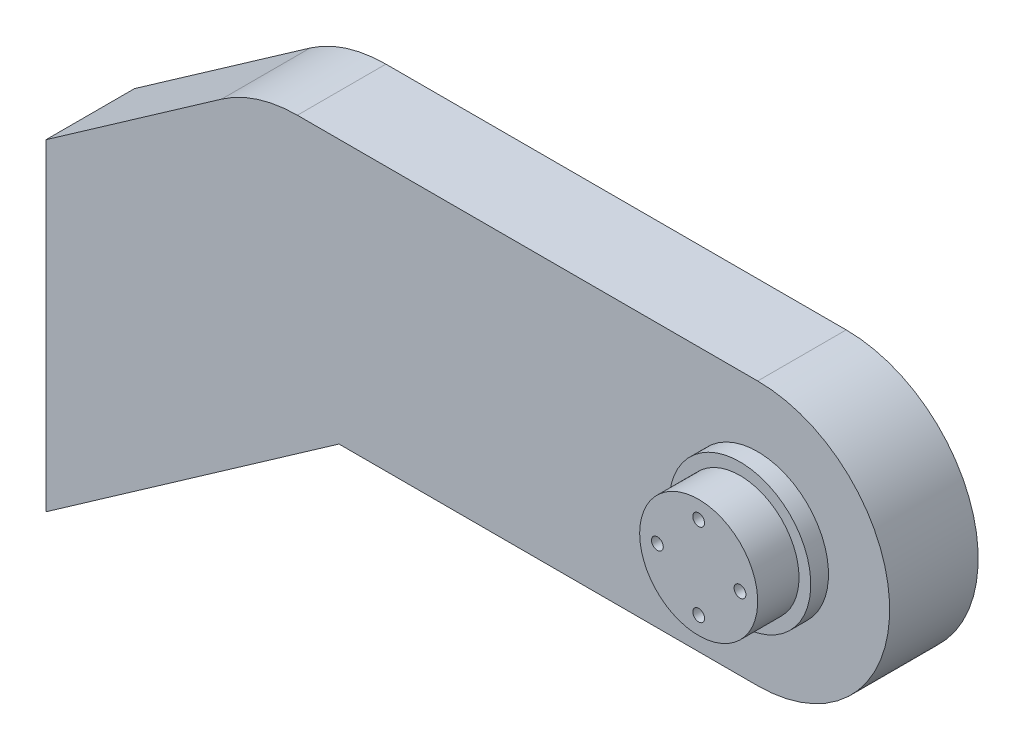
ISO-10303-21;
HEADER;
FILE_DESCRIPTION(('STEP AP214'),'2;1');
FILE_NAME('part.step','',(''),(''),'','','');
FILE_SCHEMA(('AUTOMOTIVE_DESIGN { 1 0 10303 214 1 1 1 1 }'));
ENDSEC;
DATA;
#1=APPLICATION_CONTEXT('core data for automotive mechanical design processes');
#2=APPLICATION_PROTOCOL_DEFINITION('international standard','automotive_design',2000,#1);
#3=PRODUCT_CONTEXT('',#1,'mechanical');
#4=PRODUCT('Part','Part','',(#3));
#5=PRODUCT_RELATED_PRODUCT_CATEGORY('part','',(#4));
#6=PRODUCT_DEFINITION_FORMATION('','',#4);
#7=PRODUCT_DEFINITION_CONTEXT('part definition',#1,'design');
#8=PRODUCT_DEFINITION('design','',#6,#7);
#9=PRODUCT_DEFINITION_SHAPE('','',#8);
#10=(LENGTH_UNIT() NAMED_UNIT(*) SI_UNIT(.MILLI.,.METRE.));
#11=(NAMED_UNIT(*) PLANE_ANGLE_UNIT() SI_UNIT($,.RADIAN.));
#12=(NAMED_UNIT(*) SI_UNIT($,.STERADIAN.) SOLID_ANGLE_UNIT());
#13=UNCERTAINTY_MEASURE_WITH_UNIT(LENGTH_MEASURE(1.E-05),#10,'distance_accuracy_value','');
#14=(GEOMETRIC_REPRESENTATION_CONTEXT(3) GLOBAL_UNCERTAINTY_ASSIGNED_CONTEXT((#13)) GLOBAL_UNIT_ASSIGNED_CONTEXT((#10,
#11,#12)) REPRESENTATION_CONTEXT('',''));
#15=CARTESIAN_POINT('',(0.,0.,0.));
#16=DIRECTION('',(0.,0.,1.));
#17=DIRECTION('',(1.,0.,0.));
#18=AXIS2_PLACEMENT_3D('',#15,#16,#17);
#19=CARTESIAN_POINT('',(153.21162338788,22.365,25.));
#20=DIRECTION('',(0.,0.,-1.));
#21=DIRECTION('',(-1.,0.,0.));
#22=AXIS2_PLACEMENT_3D('',#19,#20,#21);
#23=CYLINDRICAL_SURFACE('',#22,10.);
#24=CARTESIAN_POINT('',(153.21162338788,22.365,25.));
#25=DIRECTION('',(0.,0.,-1.));
#26=DIRECTION('',(-1.,0.,0.));
#27=AXIS2_PLACEMENT_3D('',#24,#25,#26);
#28=CIRCLE('',#27,10.);
#29=CARTESIAN_POINT('',(143.21162338788,22.365,25.));
#30=VERTEX_POINT('',#29);
#31=EDGE_CURVE('E146',#30,#30,#28,.T.);
#32=ORIENTED_EDGE('',*,*,#31,.T.);
#33=EDGE_LOOP('',(#32));
#34=FACE_BOUND('',#33,.T.);
#35=CARTESIAN_POINT('',(153.21162338788,22.365,18.));
#36=DIRECTION('',(0.,0.,-1.));
#37=DIRECTION('',(-1.,0.,0.));
#38=AXIS2_PLACEMENT_3D('',#35,#36,#37);
#39=CIRCLE('',#38,10.);
#40=CARTESIAN_POINT('',(143.21162338788,22.365,18.));
#41=VERTEX_POINT('',#40);
#42=EDGE_CURVE('E200',#41,#41,#39,.T.);
#43=ORIENTED_EDGE('',*,*,#42,.F.);
#44=EDGE_LOOP('',(#43));
#45=FACE_BOUND('',#44,.T.);
#46=ADVANCED_FACE('F47',(#34,#45),#23,.T.);
#47=CARTESIAN_POINT('',(153.21162338788,22.365,25.));
#48=DIRECTION('',(0.,0.,-1.));
#49=DIRECTION('',(-1.,0.,0.));
#50=AXIS2_PLACEMENT_3D('',#47,#48,#49);
#51=PLANE('',#50);
#52=CARTESIAN_POINT('',(153.21162338788,29.365,25.));
#53=DIRECTION('',(0.,0.,1.));
#54=DIRECTION('',(1.,0.,0.));
#55=AXIS2_PLACEMENT_3D('',#52,#53,#54);
#56=CIRCLE('',#55,0.999999999999998);
#57=CARTESIAN_POINT('',(154.21162338788,29.365,25.));
#58=VERTEX_POINT('',#57);
#59=EDGE_CURVE('E160',#58,#58,#56,.T.);
#60=ORIENTED_EDGE('',*,*,#59,.F.);
#61=EDGE_LOOP('',(#60));
#62=FACE_BOUND('',#61,.T.);
#63=CARTESIAN_POINT('',(146.21162338788,22.3649999999999,25.));
#64=DIRECTION('',(0.,0.,1.));
#65=DIRECTION('',(1.,0.,0.));
#66=AXIS2_PLACEMENT_3D('',#63,#64,#65);
#67=CIRCLE('',#66,0.99999999999999);
#68=CARTESIAN_POINT('',(147.21162338788,22.3649999999999,25.));
#69=VERTEX_POINT('',#68);
#70=EDGE_CURVE('E163',#69,#69,#67,.T.);
#71=ORIENTED_EDGE('',*,*,#70,.F.);
#72=EDGE_LOOP('',(#71));
#73=FACE_BOUND('',#72,.T.);
#74=CARTESIAN_POINT('',(153.21162338788,15.365,25.));
#75=DIRECTION('',(0.,0.,1.));
#76=DIRECTION('',(1.,0.,0.));
#77=AXIS2_PLACEMENT_3D('',#74,#75,#76);
#78=CIRCLE('',#77,0.999999999999996);
#79=CARTESIAN_POINT('',(154.21162338788,15.365,25.));
#80=VERTEX_POINT('',#79);
#81=EDGE_CURVE('E154',#80,#80,#78,.T.);
#82=ORIENTED_EDGE('',*,*,#81,.F.);
#83=EDGE_LOOP('',(#82));
#84=FACE_BOUND('',#83,.T.);
#85=CARTESIAN_POINT('',(160.21162338788,22.3650000000002,25.));
#86=DIRECTION('',(0.,0.,1.));
#87=DIRECTION('',(1.,0.,0.));
#88=AXIS2_PLACEMENT_3D('',#85,#86,#87);
#89=CIRCLE('',#88,0.999999999999998);
#90=CARTESIAN_POINT('',(161.21162338788,22.3650000000002,25.));
#91=VERTEX_POINT('',#90);
#92=EDGE_CURVE('E151',#91,#91,#89,.T.);
#93=ORIENTED_EDGE('',*,*,#92,.F.);
#94=EDGE_LOOP('',(#93));
#95=FACE_BOUND('',#94,.T.);
#96=ORIENTED_EDGE('',*,*,#31,.F.);
#97=EDGE_LOOP('',(#96));
#98=FACE_BOUND('',#97,.T.);
#99=ADVANCED_FACE('F210',(#62,#73,#84,#95,#98),#51,.F.);
#100=CARTESIAN_POINT('',(160.21162338788,22.3650000000002,20.));
#101=DIRECTION('',(0.,0.,1.));
#102=DIRECTION('',(1.,0.,0.));
#103=AXIS2_PLACEMENT_3D('',#100,#101,#102);
#104=CYLINDRICAL_SURFACE('',#103,0.999999999999998);
#105=CARTESIAN_POINT('',(160.21162338788,22.3650000000002,20.));
#106=DIRECTION('',(0.,0.,1.));
#107=DIRECTION('',(1.,0.,0.));
#108=AXIS2_PLACEMENT_3D('',#105,#106,#107);
#109=CIRCLE('',#108,0.999999999999998);
#110=CARTESIAN_POINT('',(161.21162338788,22.3650000000002,20.));
#111=VERTEX_POINT('',#110);
#112=EDGE_CURVE('E150',#111,#111,#109,.T.);
#113=ORIENTED_EDGE('',*,*,#112,.F.);
#114=EDGE_LOOP('',(#113));
#115=FACE_BOUND('',#114,.T.);
#116=ORIENTED_EDGE('',*,*,#92,.T.);
#117=EDGE_LOOP('',(#116));
#118=FACE_BOUND('',#117,.T.);
#119=ADVANCED_FACE('F215',(#115,#118),#104,.F.);
#120=CARTESIAN_POINT('',(160.21162338788,22.3650000000002,20.));
#121=DIRECTION('',(0.,0.,1.));
#122=DIRECTION('',(1.,0.,0.));
#123=AXIS2_PLACEMENT_3D('',#120,#121,#122);
#124=PLANE('',#123);
#125=ORIENTED_EDGE('',*,*,#112,.T.);
#126=EDGE_LOOP('',(#125));
#127=FACE_BOUND('',#126,.T.);
#128=ADVANCED_FACE('F263',(#127),#124,.T.);
#129=CARTESIAN_POINT('',(153.21162338788,15.365,20.));
#130=DIRECTION('',(0.,0.,1.));
#131=DIRECTION('',(1.,0.,0.));
#132=AXIS2_PLACEMENT_3D('',#129,#130,#131);
#133=CYLINDRICAL_SURFACE('',#132,0.999999999999996);
#134=CARTESIAN_POINT('',(153.21162338788,15.365,20.));
#135=DIRECTION('',(0.,0.,1.));
#136=DIRECTION('',(1.,0.,0.));
#137=AXIS2_PLACEMENT_3D('',#134,#135,#136);
#138=CIRCLE('',#137,0.999999999999996);
#139=CARTESIAN_POINT('',(154.21162338788,15.365,20.));
#140=VERTEX_POINT('',#139);
#141=EDGE_CURVE('E164',#140,#140,#138,.T.);
#142=ORIENTED_EDGE('',*,*,#141,.F.);
#143=EDGE_LOOP('',(#142));
#144=FACE_BOUND('',#143,.T.);
#145=ORIENTED_EDGE('',*,*,#81,.T.);
#146=EDGE_LOOP('',(#145));
#147=FACE_BOUND('',#146,.T.);
#148=ADVANCED_FACE('F257',(#144,#147),#133,.F.);
#149=CARTESIAN_POINT('',(153.21162338788,15.365,20.));
#150=DIRECTION('',(0.,0.,1.));
#151=DIRECTION('',(1.,0.,0.));
#152=AXIS2_PLACEMENT_3D('',#149,#150,#151);
#153=PLANE('',#152);
#154=ORIENTED_EDGE('',*,*,#141,.T.);
#155=EDGE_LOOP('',(#154));
#156=FACE_BOUND('',#155,.T.);
#157=ADVANCED_FACE('F260',(#156),#153,.T.);
#158=CARTESIAN_POINT('',(146.21162338788,22.3649999999999,20.));
#159=DIRECTION('',(0.,0.,1.));
#160=DIRECTION('',(1.,0.,0.));
#161=AXIS2_PLACEMENT_3D('',#158,#159,#160);
#162=CYLINDRICAL_SURFACE('',#161,0.99999999999999);
#163=CARTESIAN_POINT('',(146.21162338788,22.3649999999999,20.));
#164=DIRECTION('',(0.,0.,1.));
#165=DIRECTION('',(1.,0.,0.));
#166=AXIS2_PLACEMENT_3D('',#163,#164,#165);
#167=CIRCLE('',#166,0.99999999999999);
#168=CARTESIAN_POINT('',(147.21162338788,22.3649999999999,20.));
#169=VERTEX_POINT('',#168);
#170=EDGE_CURVE('E158',#169,#169,#167,.T.);
#171=ORIENTED_EDGE('',*,*,#170,.F.);
#172=EDGE_LOOP('',(#171));
#173=FACE_BOUND('',#172,.T.);
#174=ORIENTED_EDGE('',*,*,#70,.T.);
#175=EDGE_LOOP('',(#174));
#176=FACE_BOUND('',#175,.T.);
#177=ADVANCED_FACE('F262',(#173,#176),#162,.F.);
#178=CARTESIAN_POINT('',(146.21162338788,22.3649999999999,20.));
#179=DIRECTION('',(0.,0.,1.));
#180=DIRECTION('',(1.,0.,0.));
#181=AXIS2_PLACEMENT_3D('',#178,#179,#180);
#182=PLANE('',#181);
#183=ORIENTED_EDGE('',*,*,#170,.T.);
#184=EDGE_LOOP('',(#183));
#185=FACE_BOUND('',#184,.T.);
#186=ADVANCED_FACE('F253',(#185),#182,.T.);
#187=CARTESIAN_POINT('',(153.21162338788,29.365,20.));
#188=DIRECTION('',(0.,0.,1.));
#189=DIRECTION('',(1.,0.,0.));
#190=AXIS2_PLACEMENT_3D('',#187,#188,#189);
#191=CYLINDRICAL_SURFACE('',#190,0.999999999999998);
#192=CARTESIAN_POINT('',(153.21162338788,29.365,20.));
#193=DIRECTION('',(0.,0.,1.));
#194=DIRECTION('',(1.,0.,0.));
#195=AXIS2_PLACEMENT_3D('',#192,#193,#194);
#196=CIRCLE('',#195,0.999999999999998);
#197=CARTESIAN_POINT('',(154.21162338788,29.365,20.));
#198=VERTEX_POINT('',#197);
#199=EDGE_CURVE('E148',#198,#198,#196,.T.);
#200=ORIENTED_EDGE('',*,*,#199,.F.);
#201=EDGE_LOOP('',(#200));
#202=FACE_BOUND('',#201,.T.);
#203=ORIENTED_EDGE('',*,*,#59,.T.);
#204=EDGE_LOOP('',(#203));
#205=FACE_BOUND('',#204,.T.);
#206=ADVANCED_FACE('F252',(#202,#205),#191,.F.);
#207=CARTESIAN_POINT('',(153.21162338788,29.365,20.));
#208=DIRECTION('',(0.,0.,1.));
#209=DIRECTION('',(1.,0.,0.));
#210=AXIS2_PLACEMENT_3D('',#207,#208,#209);
#211=PLANE('',#210);
#212=ORIENTED_EDGE('',*,*,#199,.T.);
#213=EDGE_LOOP('',(#212));
#214=FACE_BOUND('',#213,.T.);
#215=ADVANCED_FACE('F250',(#214),#211,.T.);
#216=CARTESIAN_POINT('',(153.21162338788,22.365,18.));
#217=DIRECTION('',(0.,0.,-1.));
#218=DIRECTION('',(-1.,0.,0.));
#219=AXIS2_PLACEMENT_3D('',#216,#217,#218);
#220=CYLINDRICAL_SURFACE('',#219,12.);
#221=CARTESIAN_POINT('',(153.21162338788,22.365,18.));
#222=DIRECTION('',(0.,0.,-1.));
#223=DIRECTION('',(-1.,0.,0.));
#224=AXIS2_PLACEMENT_3D('',#221,#222,#223);
#225=CIRCLE('',#224,12.);
#226=CARTESIAN_POINT('',(141.21162338788,22.365,18.));
#227=VERTEX_POINT('',#226);
#228=EDGE_CURVE('E133',#227,#227,#225,.T.);
#229=ORIENTED_EDGE('',*,*,#228,.T.);
#230=EDGE_LOOP('',(#229));
#231=FACE_BOUND('',#230,.T.);
#232=CARTESIAN_POINT('',(153.21162338788,22.365,15.));
#233=DIRECTION('',(0.,0.,-1.));
#234=DIRECTION('',(-1.,0.,0.));
#235=AXIS2_PLACEMENT_3D('',#232,#233,#234);
#236=CIRCLE('',#235,12.);
#237=CARTESIAN_POINT('',(141.21162338788,22.365,15.));
#238=VERTEX_POINT('',#237);
#239=EDGE_CURVE('E193',#238,#238,#236,.T.);
#240=ORIENTED_EDGE('',*,*,#239,.F.);
#241=EDGE_LOOP('',(#240));
#242=FACE_BOUND('',#241,.T.);
#243=ADVANCED_FACE('F249',(#231,#242),#220,.T.);
#244=CARTESIAN_POINT('',(153.21162338788,22.365,18.));
#245=DIRECTION('',(0.,0.,-1.));
#246=DIRECTION('',(-1.,0.,0.));
#247=AXIS2_PLACEMENT_3D('',#244,#245,#246);
#248=PLANE('',#247);
#249=ORIENTED_EDGE('',*,*,#42,.T.);
#250=EDGE_LOOP('',(#249));
#251=FACE_BOUND('',#250,.T.);
#252=ORIENTED_EDGE('',*,*,#228,.F.);
#253=EDGE_LOOP('',(#252));
#254=FACE_BOUND('',#253,.T.);
#255=ADVANCED_FACE('F203',(#251,#254),#248,.F.);
#256=CARTESIAN_POINT('',(0.,0.,0.));
#257=DIRECTION('',(0.,0.,-1.));
#258=DIRECTION('',(-1.,0.,0.));
#259=AXIS2_PLACEMENT_3D('',#256,#257,#258);
#260=PLANE('',#259);
#261=DIRECTION('',(0.,-1.,0.));
#262=VECTOR('',#261,1.);
#263=CARTESIAN_POINT('',(32.6157170848524,0.,0.));
#264=LINE('',#263,#262);
#265=CARTESIAN_POINT('',(32.6157170848524,19.8416489873955,0.));
#266=VERTEX_POINT('',#265);
#267=CARTESIAN_POINT('',(32.6157170848524,-34.7635983679045,0.));
#268=VERTEX_POINT('',#267);
#269=EDGE_CURVE('E182',#266,#268,#264,.T.);
#270=ORIENTED_EDGE('',*,*,#269,.F.);
#271=DIRECTION('',(-0.819152044288991,-0.573576436351047,0.));
#272=VECTOR('',#271,1.);
#273=CARTESIAN_POINT('',(62.3835863888887,40.6853354705233,0.));
#274=LINE('',#273,#272);
#275=CARTESIAN_POINT('',(62.3835863888887,40.6853354705233,0.));
#276=VERTEX_POINT('',#275);
#277=EDGE_CURVE('E121',#276,#266,#274,.T.);
#278=ORIENTED_EDGE('',*,*,#277,.F.);
#279=CARTESIAN_POINT('',(75.2116233878799,22.365,0.));
#280=DIRECTION('',(0.,0.,1.));
#281=DIRECTION('',(-1.,0.,0.));
#282=AXIS2_PLACEMENT_3D('',#279,#280,#281);
#283=CIRCLE('',#282,22.365);
#284=CARTESIAN_POINT('',(75.2116233878799,44.73,0.));
#285=VERTEX_POINT('',#284);
#286=EDGE_CURVE('E116',#285,#276,#283,.T.);
#287=ORIENTED_EDGE('',*,*,#286,.F.);
#288=DIRECTION('',(-1.,0.,0.));
#289=VECTOR('',#288,1.);
#290=CARTESIAN_POINT('',(0.,44.73,0.));
#291=LINE('',#290,#289);
#292=CARTESIAN_POINT('',(153.21162338788,44.73,0.));
#293=VERTEX_POINT('',#292);
#294=EDGE_CURVE('E52',#293,#285,#291,.T.);
#295=ORIENTED_EDGE('',*,*,#294,.F.);
#296=CARTESIAN_POINT('',(153.21162338788,22.365,0.));
#297=DIRECTION('',(0.,0.,-1.));
#298=DIRECTION('',(-1.,0.,0.));
#299=AXIS2_PLACEMENT_3D('',#296,#297,#298);
#300=CIRCLE('',#299,22.365);
#301=CARTESIAN_POINT('',(153.21162338788,0.,0.));
#302=VERTEX_POINT('',#301);
#303=EDGE_CURVE('E144',#302,#293,#300,.F.);
#304=ORIENTED_EDGE('',*,*,#303,.F.);
#305=DIRECTION('',(1.,0.,0.));
#306=VECTOR('',#305,1.);
#307=CARTESIAN_POINT('',(0.,0.,0.));
#308=LINE('',#307,#306);
#309=CARTESIAN_POINT('',(82.2632808011584,0.,0.));
#310=VERTEX_POINT('',#309);
#311=EDGE_CURVE('E73',#310,#302,#308,.T.);
#312=ORIENTED_EDGE('',*,*,#311,.F.);
#313=DIRECTION('',(-0.819152044288991,-0.573576436351047,0.));
#314=VECTOR('',#313,1.);
#315=CARTESIAN_POINT('',(27.0637908555533,-38.6510989652439,0.));
#316=LINE('',#315,#314);
#317=EDGE_CURVE('E179',#310,#268,#316,.T.);
#318=ORIENTED_EDGE('',*,*,#317,.T.);
#319=EDGE_LOOP('',(#270,#278,#287,#295,#304,#312,#318));
#320=FACE_BOUND('',#319,.T.);
#321=ADVANCED_FACE('F129',(#320),#260,.T.);
#322=CARTESIAN_POINT('',(75.2116233878799,22.365,102.507492208612));
#323=DIRECTION('',(0.,0.,-1.));
#324=DIRECTION('',(-1.,0.,0.));
#325=AXIS2_PLACEMENT_3D('',#322,#323,#324);
#326=CYLINDRICAL_SURFACE('',#325,22.365);
#327=CARTESIAN_POINT('',(75.2116233878799,22.365,15.));
#328=DIRECTION('',(0.,0.,-1.));
#329=DIRECTION('',(-1.,0.,0.));
#330=AXIS2_PLACEMENT_3D('',#327,#328,#329);
#331=CIRCLE('',#330,22.365);
#332=CARTESIAN_POINT('',(62.3835863888887,40.6853354705233,15.));
#333=VERTEX_POINT('',#332);
#334=CARTESIAN_POINT('',(75.2116233878799,44.73,15.));
#335=VERTEX_POINT('',#334);
#336=EDGE_CURVE('E118',#333,#335,#331,.T.);
#337=ORIENTED_EDGE('',*,*,#336,.T.);
#338=DIRECTION('',(0.,0.,-1.));
#339=VECTOR('',#338,1.);
#340=CARTESIAN_POINT('',(75.2116233878799,44.73,102.507492208612));
#341=LINE('',#340,#339);
#342=EDGE_CURVE('E115',#335,#285,#341,.T.);
#343=ORIENTED_EDGE('',*,*,#342,.T.);
#344=ORIENTED_EDGE('',*,*,#286,.T.);
#345=DIRECTION('',(0.,0.,-1.));
#346=VECTOR('',#345,1.);
#347=CARTESIAN_POINT('',(62.3835863888887,40.6853354705233,102.507492208612));
#348=LINE('',#347,#346);
#349=EDGE_CURVE('E124',#333,#276,#348,.T.);
#350=ORIENTED_EDGE('',*,*,#349,.F.);
#351=EDGE_LOOP('',(#337,#343,#344,#350));
#352=FACE_BOUND('',#351,.T.);
#353=ADVANCED_FACE('F112',(#352),#326,.T.);
#354=CARTESIAN_POINT('',(0.,44.73,15.));
#355=DIRECTION('',(0.,-1.,0.));
#356=DIRECTION('',(0.,0.,-1.));
#357=AXIS2_PLACEMENT_3D('',#354,#355,#356);
#358=PLANE('',#357);
#359=ORIENTED_EDGE('',*,*,#294,.T.);
#360=ORIENTED_EDGE('',*,*,#342,.F.);
#361=DIRECTION('',(-1.,0.,0.));
#362=VECTOR('',#361,1.);
#363=CARTESIAN_POINT('',(0.,44.73,15.));
#364=LINE('',#363,#362);
#365=CARTESIAN_POINT('',(153.21162338788,44.73,15.));
#366=VERTEX_POINT('',#365);
#367=EDGE_CURVE('E12',#366,#335,#364,.T.);
#368=ORIENTED_EDGE('',*,*,#367,.F.);
#369=DIRECTION('',(0.,0.,1.));
#370=VECTOR('',#369,1.);
#371=CARTESIAN_POINT('',(153.21162338788,44.73,-0.000999999999999265));
#372=LINE('',#371,#370);
#373=EDGE_CURVE('E132',#293,#366,#372,.T.);
#374=ORIENTED_EDGE('',*,*,#373,.F.);
#375=EDGE_LOOP('',(#359,#360,#368,#374));
#376=FACE_BOUND('',#375,.T.);
#377=ADVANCED_FACE('F134',(#376),#358,.F.);
#378=CARTESIAN_POINT('',(153.21162338788,22.365,-0.000999999999999265));
#379=DIRECTION('',(0.,0.,1.));
#380=DIRECTION('',(1.,0.,0.));
#381=AXIS2_PLACEMENT_3D('',#378,#379,#380);
#382=CYLINDRICAL_SURFACE('',#381,22.365);
#383=ORIENTED_EDGE('',*,*,#303,.T.);
#384=ORIENTED_EDGE('',*,*,#373,.T.);
#385=CARTESIAN_POINT('',(153.21162338788,22.365,15.));
#386=DIRECTION('',(0.,0.,1.));
#387=DIRECTION('',(1.,0.,0.));
#388=AXIS2_PLACEMENT_3D('',#385,#386,#387);
#389=CIRCLE('',#388,22.365);
#390=CARTESIAN_POINT('',(153.21162338788,0.,15.));
#391=VERTEX_POINT('',#390);
#392=EDGE_CURVE('E139',#391,#366,#389,.T.);
#393=ORIENTED_EDGE('',*,*,#392,.F.);
#394=DIRECTION('',(0.,0.,1.));
#395=VECTOR('',#394,1.);
#396=CARTESIAN_POINT('',(153.21162338788,0.,-0.000999999999999265));
#397=LINE('',#396,#395);
#398=EDGE_CURVE('E140',#302,#391,#397,.T.);
#399=ORIENTED_EDGE('',*,*,#398,.F.);
#400=EDGE_LOOP('',(#383,#384,#393,#399));
#401=FACE_BOUND('',#400,.T.);
#402=ADVANCED_FACE('F217',(#401),#382,.T.);
#403=CARTESIAN_POINT('',(0.,0.,15.));
#404=DIRECTION('',(0.,1.,0.));
#405=DIRECTION('',(0.,0.,1.));
#406=AXIS2_PLACEMENT_3D('',#403,#404,#405);
#407=PLANE('',#406);
#408=DIRECTION('',(1.,0.,0.));
#409=VECTOR('',#408,1.);
#410=CARTESIAN_POINT('',(0.,0.,15.));
#411=LINE('',#410,#409);
#412=CARTESIAN_POINT('',(82.2632808011584,0.,15.));
#413=VERTEX_POINT('',#412);
#414=EDGE_CURVE('E59',#413,#391,#411,.T.);
#415=ORIENTED_EDGE('',*,*,#414,.F.);
#416=DIRECTION('',(0.,0.,-1.));
#417=VECTOR('',#416,1.);
#418=CARTESIAN_POINT('',(82.2632808011584,0.,178.575832299459));
#419=LINE('',#418,#417);
#420=EDGE_CURVE('E68',#413,#310,#419,.T.);
#421=ORIENTED_EDGE('',*,*,#420,.T.);
#422=ORIENTED_EDGE('',*,*,#311,.T.);
#423=ORIENTED_EDGE('',*,*,#398,.T.);
#424=EDGE_LOOP('',(#415,#421,#422,#423));
#425=FACE_BOUND('',#424,.T.);
#426=ADVANCED_FACE('F51',(#425),#407,.F.);
#427=CARTESIAN_POINT('',(27.0637908555533,-38.6510989652439,178.575832299459));
#428=DIRECTION('',(0.573576436351047,-0.819152044288991,0.));
#429=DIRECTION('',(0.819152044288991,0.573576436351047,0.));
#430=AXIS2_PLACEMENT_3D('',#427,#428,#429);
#431=PLANE('',#430);
#432=DIRECTION('',(0.819152044288991,0.573576436351047,0.));
#433=VECTOR('',#432,1.);
#434=CARTESIAN_POINT('',(27.0637908555533,-38.6510989652439,15.));
#435=LINE('',#434,#433);
#436=CARTESIAN_POINT('',(32.6157170848524,-34.7635983679045,15.));
#437=VERTEX_POINT('',#436);
#438=EDGE_CURVE('E162',#437,#413,#435,.T.);
#439=ORIENTED_EDGE('',*,*,#438,.F.);
#440=DIRECTION('',(0.,0.,-1.));
#441=VECTOR('',#440,1.);
#442=CARTESIAN_POINT('',(32.6157170848524,-34.7635983679045,178.575832299459));
#443=LINE('',#442,#441);
#444=EDGE_CURVE('E176',#437,#268,#443,.T.);
#445=ORIENTED_EDGE('',*,*,#444,.T.);
#446=ORIENTED_EDGE('',*,*,#317,.F.);
#447=ORIENTED_EDGE('',*,*,#420,.F.);
#448=EDGE_LOOP('',(#439,#445,#446,#447));
#449=FACE_BOUND('',#448,.T.);
#450=ADVANCED_FACE('F241',(#449),#431,.T.);
#451=CARTESIAN_POINT('',(32.6157170848524,0.,178.575832299459));
#452=DIRECTION('',(1.,0.,0.));
#453=DIRECTION('',(0.,1.,0.));
#454=AXIS2_PLACEMENT_3D('',#451,#452,#453);
#455=PLANE('',#454);
#456=DIRECTION('',(0.,1.,0.));
#457=VECTOR('',#456,1.);
#458=CARTESIAN_POINT('',(32.6157170848524,0.,15.));
#459=LINE('',#458,#457);
#460=CARTESIAN_POINT('',(32.6157170848524,19.8416489873955,15.));
#461=VERTEX_POINT('',#460);
#462=EDGE_CURVE('E174',#437,#461,#459,.T.);
#463=ORIENTED_EDGE('',*,*,#462,.T.);
#464=DIRECTION('',(0.,0.,-1.));
#465=VECTOR('',#464,1.);
#466=CARTESIAN_POINT('',(32.6157170848524,19.8416489873955,102.507492208612));
#467=LINE('',#466,#465);
#468=EDGE_CURVE('E189',#461,#266,#467,.T.);
#469=ORIENTED_EDGE('',*,*,#468,.T.);
#470=ORIENTED_EDGE('',*,*,#269,.T.);
#471=ORIENTED_EDGE('',*,*,#444,.F.);
#472=EDGE_LOOP('',(#463,#469,#470,#471));
#473=FACE_BOUND('',#472,.T.);
#474=ADVANCED_FACE('F243',(#473),#455,.F.);
#475=CARTESIAN_POINT('',(62.3835863888887,40.6853354705233,102.507492208612));
#476=DIRECTION('',(0.573576436351047,-0.819152044288991,0.));
#477=DIRECTION('',(0.819152044288991,0.573576436351047,0.));
#478=AXIS2_PLACEMENT_3D('',#475,#476,#477);
#479=PLANE('',#478);
#480=DIRECTION('',(0.819152044288991,0.573576436351047,0.));
#481=VECTOR('',#480,1.);
#482=CARTESIAN_POINT('',(62.3835863888887,40.6853354705233,15.));
#483=LINE('',#482,#481);
#484=EDGE_CURVE('E184',#461,#333,#483,.T.);
#485=ORIENTED_EDGE('',*,*,#484,.T.);
#486=ORIENTED_EDGE('',*,*,#349,.T.);
#487=ORIENTED_EDGE('',*,*,#277,.T.);
#488=ORIENTED_EDGE('',*,*,#468,.F.);
#489=EDGE_LOOP('',(#485,#486,#487,#488));
#490=FACE_BOUND('',#489,.T.);
#491=ADVANCED_FACE('F227',(#490),#479,.F.);
#492=CARTESIAN_POINT('',(0.,0.,15.));
#493=DIRECTION('',(0.,0.,-1.));
#494=DIRECTION('',(-1.,0.,0.));
#495=AXIS2_PLACEMENT_3D('',#492,#493,#494);
#496=PLANE('',#495);
#497=ORIENTED_EDGE('',*,*,#239,.T.);
#498=EDGE_LOOP('',(#497));
#499=FACE_BOUND('',#498,.T.);
#500=ORIENTED_EDGE('',*,*,#484,.F.);
#501=ORIENTED_EDGE('',*,*,#462,.F.);
#502=ORIENTED_EDGE('',*,*,#438,.T.);
#503=ORIENTED_EDGE('',*,*,#414,.T.);
#504=ORIENTED_EDGE('',*,*,#392,.T.);
#505=ORIENTED_EDGE('',*,*,#367,.T.);
#506=ORIENTED_EDGE('',*,*,#336,.F.);
#507=EDGE_LOOP('',(#500,#501,#502,#503,#504,#505,#506));
#508=FACE_BOUND('',#507,.T.);
#509=ADVANCED_FACE('F222',(#499,#508),#496,.F.);
#510=CLOSED_SHELL('',(#46,#99,#119,#128,#148,#157,#177,#186,#206,#215,#243,#255,#321,#353,#377,
#402,#426,#450,#474,#491,#509));
#511=MANIFOLD_SOLID_BREP('B2',#510);
#512=ADVANCED_BREP_SHAPE_REPRESENTATION('',(#18,#511),#14);
#513=SHAPE_DEFINITION_REPRESENTATION(#9,#512);
ENDSEC;
END-ISO-10303-21;
